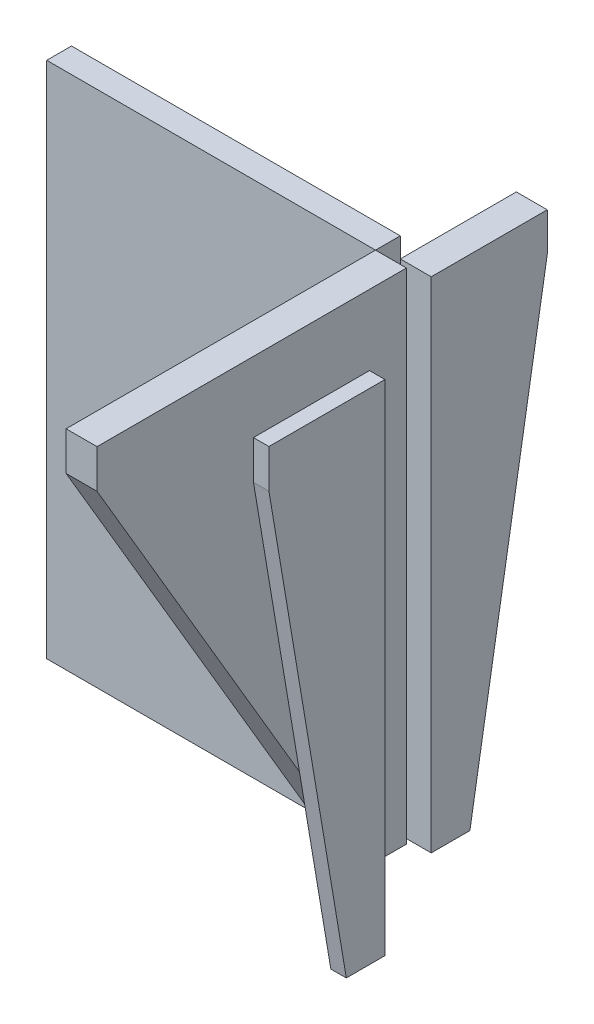
ISO-10303-21;
HEADER;
FILE_DESCRIPTION(('STEP AP214'),'2;1');
FILE_NAME('part.step','',(''),(''),'','','');
FILE_SCHEMA(('AUTOMOTIVE_DESIGN { 1 0 10303 214 1 1 1 1 }'));
ENDSEC;
DATA;
#1=APPLICATION_CONTEXT('core data for automotive mechanical design processes');
#2=APPLICATION_PROTOCOL_DEFINITION('international standard','automotive_design',2000,#1);
#3=PRODUCT_CONTEXT('',#1,'mechanical');
#4=PRODUCT('Part','Part','',(#3));
#5=PRODUCT_RELATED_PRODUCT_CATEGORY('part','',(#4));
#6=PRODUCT_DEFINITION_FORMATION('','',#4);
#7=PRODUCT_DEFINITION_CONTEXT('part definition',#1,'design');
#8=PRODUCT_DEFINITION('design','',#6,#7);
#9=PRODUCT_DEFINITION_SHAPE('','',#8);
#10=(LENGTH_UNIT() NAMED_UNIT(*) SI_UNIT(.MILLI.,.METRE.));
#11=(NAMED_UNIT(*) PLANE_ANGLE_UNIT() SI_UNIT($,.RADIAN.));
#12=(NAMED_UNIT(*) SI_UNIT($,.STERADIAN.) SOLID_ANGLE_UNIT());
#13=UNCERTAINTY_MEASURE_WITH_UNIT(LENGTH_MEASURE(1.E-05),#10,'distance_accuracy_value','');
#14=(GEOMETRIC_REPRESENTATION_CONTEXT(3) GLOBAL_UNCERTAINTY_ASSIGNED_CONTEXT((#13)) GLOBAL_UNIT_ASSIGNED_CONTEXT((#10,
#11,#12)) REPRESENTATION_CONTEXT('',''));
#15=CARTESIAN_POINT('',(0.,0.,0.));
#16=DIRECTION('',(0.,0.,1.));
#17=DIRECTION('',(1.,0.,0.));
#18=AXIS2_PLACEMENT_3D('',#15,#16,#17);
#19=CARTESIAN_POINT('',(465.,-670.851907967738,0.));
#20=DIRECTION('',(0.,0.,-1.));
#21=DIRECTION('',(-1.,0.,0.));
#22=AXIS2_PLACEMENT_3D('',#19,#20,#21);
#23=PLANE('',#22);
#24=DIRECTION('',(0.,-1.,0.));
#25=VECTOR('',#24,1.);
#26=CARTESIAN_POINT('',(425.,-670.851907967738,0.));
#27=LINE('',#26,#25);
#28=CARTESIAN_POINT('',(425.,-25.8519079677383,0.));
#29=VERTEX_POINT('',#28);
#30=CARTESIAN_POINT('',(425.,-670.851907967738,0.));
#31=VERTEX_POINT('',#30);
#32=EDGE_CURVE('E12',#29,#31,#27,.T.);
#33=ORIENTED_EDGE('',*,*,#32,.T.);
#34=DIRECTION('',(-1.,0.,0.));
#35=VECTOR('',#34,1.);
#36=CARTESIAN_POINT('',(465.,-670.851907967738,0.));
#37=LINE('',#36,#35);
#38=CARTESIAN_POINT('',(465.,-670.851907967738,0.));
#39=VERTEX_POINT('',#38);
#40=EDGE_CURVE('E139',#39,#31,#37,.T.);
#41=ORIENTED_EDGE('',*,*,#40,.F.);
#42=DIRECTION('',(0.,-1.,0.));
#43=VECTOR('',#42,1.);
#44=CARTESIAN_POINT('',(465.,-670.851907967738,0.));
#45=LINE('',#44,#43);
#46=CARTESIAN_POINT('',(465.,-25.8519079677382,0.));
#47=VERTEX_POINT('',#46);
#48=EDGE_CURVE('E56',#47,#39,#45,.T.);
#49=ORIENTED_EDGE('',*,*,#48,.F.);
#50=DIRECTION('',(-1.,0.,0.));
#51=VECTOR('',#50,1.);
#52=CARTESIAN_POINT('',(465.,-25.8519079677382,0.));
#53=LINE('',#52,#51);
#54=EDGE_CURVE('E132',#47,#29,#53,.T.);
#55=ORIENTED_EDGE('',*,*,#54,.T.);
#56=EDGE_LOOP('',(#33,#41,#49,#55));
#57=FACE_BOUND('',#56,.T.);
#58=ADVANCED_FACE('F52',(#57),#23,.F.);
#59=CARTESIAN_POINT('',(465.,-670.851907967738,-50.));
#60=DIRECTION('',(0.,1.,0.));
#61=DIRECTION('',(-1.,0.,0.));
#62=AXIS2_PLACEMENT_3D('',#59,#60,#61);
#63=PLANE('',#62);
#64=DIRECTION('',(0.,0.,-1.));
#65=VECTOR('',#64,1.);
#66=CARTESIAN_POINT('',(425.,-670.851907967738,-50.));
#67=LINE('',#66,#65);
#68=CARTESIAN_POINT('',(425.,-670.851907967738,-50.));
#69=VERTEX_POINT('',#68);
#70=EDGE_CURVE('E62',#31,#69,#67,.T.);
#71=ORIENTED_EDGE('',*,*,#70,.T.);
#72=DIRECTION('',(-1.,0.,0.));
#73=VECTOR('',#72,1.);
#74=CARTESIAN_POINT('',(465.,-670.851907967738,-50.));
#75=LINE('',#74,#73);
#76=CARTESIAN_POINT('',(465.,-670.851907967738,-50.));
#77=VERTEX_POINT('',#76);
#78=EDGE_CURVE('E114',#77,#69,#75,.T.);
#79=ORIENTED_EDGE('',*,*,#78,.F.);
#80=DIRECTION('',(0.,0.,-1.));
#81=VECTOR('',#80,1.);
#82=CARTESIAN_POINT('',(465.,-670.851907967738,-50.));
#83=LINE('',#82,#81);
#84=EDGE_CURVE('E89',#39,#77,#83,.T.);
#85=ORIENTED_EDGE('',*,*,#84,.F.);
#86=ORIENTED_EDGE('',*,*,#40,.T.);
#87=EDGE_LOOP('',(#71,#79,#85,#86));
#88=FACE_BOUND('',#87,.T.);
#89=ADVANCED_FACE('F152',(#88),#63,.F.);
#90=CARTESIAN_POINT('',(465.,-75.8519079677382,-150.));
#91=DIRECTION('',(0.,0.165742694417267,0.986169031782739));
#92=DIRECTION('',(0.,-0.986169031782739,0.165742694417267));
#93=AXIS2_PLACEMENT_3D('',#90,#91,#92);
#94=PLANE('',#93);
#95=DIRECTION('',(0.,0.986169031782739,-0.165742694417267));
#96=VECTOR('',#95,1.);
#97=CARTESIAN_POINT('',(425.,-75.8519079677383,-150.));
#98=LINE('',#97,#96);
#99=CARTESIAN_POINT('',(425.,-75.8519079677383,-150.));
#100=VERTEX_POINT('',#99);
#101=EDGE_CURVE('E108',#69,#100,#98,.T.);
#102=ORIENTED_EDGE('',*,*,#101,.T.);
#103=DIRECTION('',(-1.,0.,0.));
#104=VECTOR('',#103,1.);
#105=CARTESIAN_POINT('',(465.,-75.8519079677382,-150.));
#106=LINE('',#105,#104);
#107=CARTESIAN_POINT('',(465.,-75.8519079677382,-150.));
#108=VERTEX_POINT('',#107);
#109=EDGE_CURVE('E112',#108,#100,#106,.T.);
#110=ORIENTED_EDGE('',*,*,#109,.F.);
#111=DIRECTION('',(0.,0.986169031782739,-0.165742694417267));
#112=VECTOR('',#111,1.);
#113=CARTESIAN_POINT('',(465.,-75.8519079677382,-150.));
#114=LINE('',#113,#112);
#115=EDGE_CURVE('E134',#77,#108,#114,.T.);
#116=ORIENTED_EDGE('',*,*,#115,.F.);
#117=ORIENTED_EDGE('',*,*,#78,.T.);
#118=EDGE_LOOP('',(#102,#110,#116,#117));
#119=FACE_BOUND('',#118,.T.);
#120=ADVANCED_FACE('F110',(#119),#94,.F.);
#121=CARTESIAN_POINT('',(465.,-25.8519079677382,-150.));
#122=DIRECTION('',(0.,0.,1.));
#123=DIRECTION('',(1.,0.,0.));
#124=AXIS2_PLACEMENT_3D('',#121,#122,#123);
#125=PLANE('',#124);
#126=DIRECTION('',(0.,1.,0.));
#127=VECTOR('',#126,1.);
#128=CARTESIAN_POINT('',(425.,-25.8519079677383,-150.));
#129=LINE('',#128,#127);
#130=CARTESIAN_POINT('',(425.,-25.8519079677383,-150.));
#131=VERTEX_POINT('',#130);
#132=EDGE_CURVE('E116',#100,#131,#129,.T.);
#133=ORIENTED_EDGE('',*,*,#132,.T.);
#134=DIRECTION('',(-1.,0.,0.));
#135=VECTOR('',#134,1.);
#136=CARTESIAN_POINT('',(465.,-25.8519079677382,-150.));
#137=LINE('',#136,#135);
#138=CARTESIAN_POINT('',(465.,-25.8519079677382,-150.));
#139=VERTEX_POINT('',#138);
#140=EDGE_CURVE('E122',#139,#131,#137,.T.);
#141=ORIENTED_EDGE('',*,*,#140,.F.);
#142=DIRECTION('',(0.,1.,0.));
#143=VECTOR('',#142,1.);
#144=CARTESIAN_POINT('',(465.,-25.8519079677382,-150.));
#145=LINE('',#144,#143);
#146=EDGE_CURVE('E121',#108,#139,#145,.T.);
#147=ORIENTED_EDGE('',*,*,#146,.F.);
#148=ORIENTED_EDGE('',*,*,#109,.T.);
#149=EDGE_LOOP('',(#133,#141,#147,#148));
#150=FACE_BOUND('',#149,.T.);
#151=ADVANCED_FACE('F119',(#150),#125,.F.);
#152=CARTESIAN_POINT('',(465.,-25.8519079677382,0.));
#153=DIRECTION('',(0.,-1.,0.));
#154=DIRECTION('',(1.,0.,0.));
#155=AXIS2_PLACEMENT_3D('',#152,#153,#154);
#156=PLANE('',#155);
#157=DIRECTION('',(0.,0.,1.));
#158=VECTOR('',#157,1.);
#159=CARTESIAN_POINT('',(425.,-25.8519079677383,0.));
#160=LINE('',#159,#158);
#161=EDGE_CURVE('E100',#131,#29,#160,.T.);
#162=ORIENTED_EDGE('',*,*,#161,.T.);
#163=ORIENTED_EDGE('',*,*,#54,.F.);
#164=DIRECTION('',(0.,0.,1.));
#165=VECTOR('',#164,1.);
#166=CARTESIAN_POINT('',(465.,-25.8519079677382,0.));
#167=LINE('',#166,#165);
#168=EDGE_CURVE('E130',#139,#47,#167,.T.);
#169=ORIENTED_EDGE('',*,*,#168,.F.);
#170=ORIENTED_EDGE('',*,*,#140,.T.);
#171=EDGE_LOOP('',(#162,#163,#169,#170));
#172=FACE_BOUND('',#171,.T.);
#173=ADVANCED_FACE('F143',(#172),#156,.F.);
#174=CARTESIAN_POINT('',(465.,1.59564854933399E-13,0.));
#175=DIRECTION('',(-1.,0.,0.));
#176=DIRECTION('',(0.,-1.,0.));
#177=AXIS2_PLACEMENT_3D('',#174,#175,#176);
#178=PLANE('',#177);
#179=ORIENTED_EDGE('',*,*,#48,.T.);
#180=ORIENTED_EDGE('',*,*,#84,.T.);
#181=ORIENTED_EDGE('',*,*,#115,.T.);
#182=ORIENTED_EDGE('',*,*,#146,.T.);
#183=ORIENTED_EDGE('',*,*,#168,.T.);
#184=EDGE_LOOP('',(#179,#180,#181,#182,#183));
#185=FACE_BOUND('',#184,.T.);
#186=ADVANCED_FACE('F54',(#185),#178,.F.);
#187=CARTESIAN_POINT('',(425.,1.46308460609517E-13,0.));
#188=DIRECTION('',(-1.,0.,0.));
#189=DIRECTION('',(0.,-1.,0.));
#190=AXIS2_PLACEMENT_3D('',#187,#188,#189);
#191=PLANE('',#190);
#192=ORIENTED_EDGE('',*,*,#32,.F.);
#193=ORIENTED_EDGE('',*,*,#161,.F.);
#194=ORIENTED_EDGE('',*,*,#132,.F.);
#195=ORIENTED_EDGE('',*,*,#101,.F.);
#196=ORIENTED_EDGE('',*,*,#70,.F.);
#197=EDGE_LOOP('',(#192,#193,#194,#195,#196));
#198=FACE_BOUND('',#197,.T.);
#199=ADVANCED_FACE('F124',(#198),#191,.T.);
#200=CLOSED_SHELL('',(#58,#89,#120,#151,#173,#186,#199));
#201=MANIFOLD_SOLID_BREP('B2',#200);
#202=CARTESIAN_POINT('',(465.,1.59564854933399E-13,0.));
#203=DIRECTION('',(1.,0.,0.));
#204=DIRECTION('',(0.,1.,0.));
#205=AXIS2_PLACEMENT_3D('',#202,#203,#204);
#206=PLANE('',#205);
#207=DIRECTION('',(0.,0.,-1.));
#208=VECTOR('',#207,1.);
#209=CARTESIAN_POINT('',(465.,-90.9664170347094,229.771365320521));
#210=LINE('',#209,#208);
#211=CARTESIAN_POINT('',(465.,-90.9664170347094,229.771365320521));
#212=VERTEX_POINT('',#211);
#213=CARTESIAN_POINT('',(465.,-90.9664170347094,79.7713653205213));
#214=VERTEX_POINT('',#213);
#215=EDGE_CURVE('E326',#212,#214,#210,.T.);
#216=ORIENTED_EDGE('',*,*,#215,.T.);
#217=DIRECTION('',(0.,-1.,0.));
#218=VECTOR('',#217,1.);
#219=CARTESIAN_POINT('',(465.,-90.9664170347094,79.7713653205213));
#220=LINE('',#219,#218);
#221=CARTESIAN_POINT('',(465.,-645.,79.7713653205212));
#222=VERTEX_POINT('',#221);
#223=EDGE_CURVE('E356',#214,#222,#220,.T.);
#224=ORIENTED_EDGE('',*,*,#223,.T.);
#225=DIRECTION('',(0.,0.,-1.));
#226=VECTOR('',#225,1.);
#227=CARTESIAN_POINT('',(465.,-645.,82.));
#228=LINE('',#227,#226);
#229=CARTESIAN_POINT('',(465.,-645.,32.));
#230=VERTEX_POINT('',#229);
#231=EDGE_CURVE('E251',#222,#230,#228,.T.);
#232=ORIENTED_EDGE('',*,*,#231,.T.);
#233=DIRECTION('',(0.,1.,0.));
#234=VECTOR('',#233,1.);
#235=CARTESIAN_POINT('',(465.,-645.,32.));
#236=LINE('',#235,#234);
#237=CARTESIAN_POINT('',(465.,0.,32.));
#238=VERTEX_POINT('',#237);
#239=EDGE_CURVE('E368',#230,#238,#236,.T.);
#240=ORIENTED_EDGE('',*,*,#239,.T.);
#241=DIRECTION('',(0.,0.,1.));
#242=VECTOR('',#241,1.);
#243=CARTESIAN_POINT('',(465.,0.,32.));
#244=LINE('',#243,#242);
#245=CARTESIAN_POINT('',(465.,1.0511971204924E-13,432.));
#246=VERTEX_POINT('',#245);
#247=EDGE_CURVE('E284',#238,#246,#244,.T.);
#248=ORIENTED_EDGE('',*,*,#247,.T.);
#249=DIRECTION('',(0.,-1.,0.));
#250=VECTOR('',#249,1.);
#251=CARTESIAN_POINT('',(465.,1.0511971204924E-13,432.));
#252=LINE('',#251,#250);
#253=CARTESIAN_POINT('',(465.,-49.9999999999999,432.));
#254=VERTEX_POINT('',#253);
#255=EDGE_CURVE('E371',#246,#254,#252,.T.);
#256=ORIENTED_EDGE('',*,*,#255,.T.);
#257=DIRECTION('',(0.,-0.86193421515777,-0.507020126563394));
#258=VECTOR('',#257,1.);
#259=CARTESIAN_POINT('',(465.,-49.9999999999999,432.));
#260=LINE('',#259,#258);
#261=CARTESIAN_POINT('',(465.,-494.917583723274,170.283774280426));
#262=VERTEX_POINT('',#261);
#263=EDGE_CURVE('E374',#254,#262,#260,.T.);
#264=ORIENTED_EDGE('',*,*,#263,.T.);
#265=DIRECTION('',(0.,0.986169031782739,0.165742694417267));
#266=VECTOR('',#265,1.);
#267=CARTESIAN_POINT('',(465.,-735.96641703471,129.771365320521));
#268=LINE('',#267,#266);
#269=CARTESIAN_POINT('',(465.,-140.966417034709,229.771365320521));
#270=VERTEX_POINT('',#269);
#271=EDGE_CURVE('E50',#262,#270,#268,.T.);
#272=ORIENTED_EDGE('',*,*,#271,.T.);
#273=DIRECTION('',(0.,1.,0.));
#274=VECTOR('',#273,1.);
#275=CARTESIAN_POINT('',(465.,-140.966417034709,229.771365320521));
#276=LINE('',#275,#274);
#277=EDGE_CURVE('E242',#270,#212,#276,.T.);
#278=ORIENTED_EDGE('',*,*,#277,.T.);
#279=EDGE_LOOP('',(#216,#224,#232,#240,#248,#256,#264,#272,#278));
#280=FACE_BOUND('',#279,.T.);
#281=ADVANCED_FACE('F225',(#280),#206,.T.);
#282=CARTESIAN_POINT('',(465.,-645.,32.));
#283=DIRECTION('',(0.,0.,1.));
#284=DIRECTION('',(1.,0.,0.));
#285=AXIS2_PLACEMENT_3D('',#282,#283,#284);
#286=PLANE('',#285);
#287=DIRECTION('',(0.,1.,0.));
#288=VECTOR('',#287,1.);
#289=CARTESIAN_POINT('',(425.,-645.,32.));
#290=LINE('',#289,#288);
#291=CARTESIAN_POINT('',(425.,-645.,32.));
#292=VERTEX_POINT('',#291);
#293=CARTESIAN_POINT('',(425.,0.,32.));
#294=VERTEX_POINT('',#293);
#295=EDGE_CURVE('E361',#292,#294,#290,.T.);
#296=ORIENTED_EDGE('',*,*,#295,.T.);
#297=DIRECTION('',(-1.,0.,0.));
#298=VECTOR('',#297,1.);
#299=CARTESIAN_POINT('',(465.,0.,32.));
#300=LINE('',#299,#298);
#301=EDGE_CURVE('E229',#238,#294,#300,.T.);
#302=ORIENTED_EDGE('',*,*,#301,.F.);
#303=ORIENTED_EDGE('',*,*,#239,.F.);
#304=DIRECTION('',(-1.,0.,0.));
#305=VECTOR('',#304,1.);
#306=CARTESIAN_POINT('',(465.,-645.,32.));
#307=LINE('',#306,#305);
#308=EDGE_CURVE('E379',#230,#292,#307,.T.);
#309=ORIENTED_EDGE('',*,*,#308,.T.);
#310=EDGE_LOOP('',(#296,#302,#303,#309));
#311=FACE_BOUND('',#310,.T.);
#312=ADVANCED_FACE('F227',(#311),#286,.F.);
#313=CARTESIAN_POINT('',(465.,0.,32.));
#314=DIRECTION('',(0.,-1.,0.));
#315=DIRECTION('',(1.,0.,0.));
#316=AXIS2_PLACEMENT_3D('',#313,#314,#315);
#317=PLANE('',#316);
#318=DIRECTION('',(0.,0.,1.));
#319=VECTOR('',#318,1.);
#320=CARTESIAN_POINT('',(425.,0.,32.));
#321=LINE('',#320,#319);
#322=CARTESIAN_POINT('',(425.,0.,432.));
#323=VERTEX_POINT('',#322);
#324=EDGE_CURVE('E382',#294,#323,#321,.T.);
#325=ORIENTED_EDGE('',*,*,#324,.T.);
#326=DIRECTION('',(-1.,0.,0.));
#327=VECTOR('',#326,1.);
#328=CARTESIAN_POINT('',(465.,1.0511971204924E-13,432.));
#329=LINE('',#328,#327);
#330=EDGE_CURVE('E394',#246,#323,#329,.T.);
#331=ORIENTED_EDGE('',*,*,#330,.F.);
#332=ORIENTED_EDGE('',*,*,#247,.F.);
#333=ORIENTED_EDGE('',*,*,#301,.T.);
#334=EDGE_LOOP('',(#325,#331,#332,#333));
#335=FACE_BOUND('',#334,.T.);
#336=ADVANCED_FACE('F400',(#335),#317,.F.);
#337=CARTESIAN_POINT('',(465.,1.0511971204924E-13,432.));
#338=DIRECTION('',(0.,0.,-1.));
#339=DIRECTION('',(-1.,0.,0.));
#340=AXIS2_PLACEMENT_3D('',#337,#338,#339);
#341=PLANE('',#340);
#342=DIRECTION('',(0.,-1.,0.));
#343=VECTOR('',#342,1.);
#344=CARTESIAN_POINT('',(425.,0.,432.));
#345=LINE('',#344,#343);
#346=CARTESIAN_POINT('',(425.,-49.9999999999999,432.));
#347=VERTEX_POINT('',#346);
#348=EDGE_CURVE('E384',#323,#347,#345,.T.);
#349=ORIENTED_EDGE('',*,*,#348,.T.);
#350=DIRECTION('',(-1.,0.,0.));
#351=VECTOR('',#350,1.);
#352=CARTESIAN_POINT('',(465.,-49.9999999999999,432.));
#353=LINE('',#352,#351);
#354=EDGE_CURVE('E392',#254,#347,#353,.T.);
#355=ORIENTED_EDGE('',*,*,#354,.F.);
#356=ORIENTED_EDGE('',*,*,#255,.F.);
#357=ORIENTED_EDGE('',*,*,#330,.T.);
#358=EDGE_LOOP('',(#349,#355,#356,#357));
#359=FACE_BOUND('',#358,.T.);
#360=ADVANCED_FACE('F408',(#359),#341,.F.);
#361=CARTESIAN_POINT('',(465.,-49.9999999999999,432.));
#362=DIRECTION('',(0.,0.507020126563394,-0.861934215157769));
#363=DIRECTION('',(0.,0.861934215157769,0.507020126563394));
#364=AXIS2_PLACEMENT_3D('',#361,#362,#363);
#365=PLANE('',#364);
#366=DIRECTION('',(0.,-0.86193421515777,-0.507020126563394));
#367=VECTOR('',#366,1.);
#368=CARTESIAN_POINT('',(425.,-49.9999999999999,432.));
#369=LINE('',#368,#367);
#370=CARTESIAN_POINT('',(425.,-645.,82.));
#371=VERTEX_POINT('',#370);
#372=EDGE_CURVE('E386',#347,#371,#369,.T.);
#373=ORIENTED_EDGE('',*,*,#372,.T.);
#374=DIRECTION('',(-1.,0.,0.));
#375=VECTOR('',#374,1.);
#376=CARTESIAN_POINT('',(465.,-645.,82.));
#377=LINE('',#376,#375);
#378=CARTESIAN_POINT('',(465.,-645.,82.));
#379=VERTEX_POINT('',#378);
#380=EDGE_CURVE('E390',#379,#371,#377,.T.);
#381=ORIENTED_EDGE('',*,*,#380,.F.);
#382=EDGE_CURVE('E373',#262,#379,#260,.T.);
#383=ORIENTED_EDGE('',*,*,#382,.F.);
#384=ORIENTED_EDGE('',*,*,#263,.F.);
#385=ORIENTED_EDGE('',*,*,#354,.T.);
#386=EDGE_LOOP('',(#373,#381,#383,#384,#385));
#387=FACE_BOUND('',#386,.T.);
#388=ADVANCED_FACE('F411',(#387),#365,.F.);
#389=CARTESIAN_POINT('',(465.,-645.,82.));
#390=DIRECTION('',(0.,1.,0.));
#391=DIRECTION('',(-1.,0.,0.));
#392=AXIS2_PLACEMENT_3D('',#389,#390,#391);
#393=PLANE('',#392);
#394=DIRECTION('',(0.,0.,-1.));
#395=VECTOR('',#394,1.);
#396=CARTESIAN_POINT('',(425.,-645.,82.));
#397=LINE('',#396,#395);
#398=EDGE_CURVE('E276',#371,#292,#397,.T.);
#399=ORIENTED_EDGE('',*,*,#398,.T.);
#400=ORIENTED_EDGE('',*,*,#308,.F.);
#401=ORIENTED_EDGE('',*,*,#231,.F.);
#402=EDGE_CURVE('E377',#379,#222,#228,.T.);
#403=ORIENTED_EDGE('',*,*,#402,.F.);
#404=ORIENTED_EDGE('',*,*,#380,.T.);
#405=EDGE_LOOP('',(#399,#400,#401,#403,#404));
#406=FACE_BOUND('',#405,.T.);
#407=ADVANCED_FACE('F427',(#406),#393,.F.);
#408=CARTESIAN_POINT('',(425.,1.46308460609517E-13,0.));
#409=DIRECTION('',(1.,0.,0.));
#410=DIRECTION('',(0.,1.,0.));
#411=AXIS2_PLACEMENT_3D('',#408,#409,#410);
#412=PLANE('',#411);
#413=ORIENTED_EDGE('',*,*,#295,.F.);
#414=ORIENTED_EDGE('',*,*,#398,.F.);
#415=ORIENTED_EDGE('',*,*,#372,.F.);
#416=ORIENTED_EDGE('',*,*,#348,.F.);
#417=ORIENTED_EDGE('',*,*,#324,.F.);
#418=EDGE_LOOP('',(#413,#414,#415,#416,#417));
#419=FACE_BOUND('',#418,.T.);
#420=ADVANCED_FACE('F405',(#419),#412,.F.);
#421=CARTESIAN_POINT('',(485.,-140.966417034709,229.771365320521));
#422=DIRECTION('',(0.,0.,1.));
#423=DIRECTION('',(1.,0.,0.));
#424=AXIS2_PLACEMENT_3D('',#421,#422,#423);
#425=PLANE('',#424);
#426=ORIENTED_EDGE('',*,*,#277,.F.);
#427=DIRECTION('',(-1.,0.,0.));
#428=VECTOR('',#427,1.);
#429=CARTESIAN_POINT('',(485.,-140.966417034709,229.771365320521));
#430=LINE('',#429,#428);
#431=CARTESIAN_POINT('',(485.,-140.966417034709,229.771365320521));
#432=VERTEX_POINT('',#431);
#433=EDGE_CURVE('E343',#432,#270,#430,.T.);
#434=ORIENTED_EDGE('',*,*,#433,.F.);
#435=DIRECTION('',(0.,1.,0.));
#436=VECTOR('',#435,1.);
#437=CARTESIAN_POINT('',(485.,-140.966417034709,229.771365320521));
#438=LINE('',#437,#436);
#439=CARTESIAN_POINT('',(485.,-90.9664170347094,229.771365320521));
#440=VERTEX_POINT('',#439);
#441=EDGE_CURVE('E336',#432,#440,#438,.T.);
#442=ORIENTED_EDGE('',*,*,#441,.T.);
#443=DIRECTION('',(-1.,0.,0.));
#444=VECTOR('',#443,1.);
#445=CARTESIAN_POINT('',(485.,-90.9664170347094,229.771365320521));
#446=LINE('',#445,#444);
#447=EDGE_CURVE('E321',#440,#212,#446,.T.);
#448=ORIENTED_EDGE('',*,*,#447,.T.);
#449=EDGE_LOOP('',(#426,#434,#442,#448));
#450=FACE_BOUND('',#449,.T.);
#451=ADVANCED_FACE('F342',(#450),#425,.T.);
#452=CARTESIAN_POINT('',(485.,-735.96641703471,129.771365320521));
#453=DIRECTION('',(0.,-0.165742694417267,0.986169031782739));
#454=DIRECTION('',(0.,-0.986169031782739,-0.165742694417267));
#455=AXIS2_PLACEMENT_3D('',#452,#453,#454);
#456=PLANE('',#455);
#457=CARTESIAN_POINT('',(465.,-735.96641703471,129.771365320521));
#458=VERTEX_POINT('',#457);
#459=EDGE_CURVE('E235',#458,#262,#268,.T.);
#460=ORIENTED_EDGE('',*,*,#459,.F.);
#461=DIRECTION('',(-1.,0.,0.));
#462=VECTOR('',#461,1.);
#463=CARTESIAN_POINT('',(485.,-735.96641703471,129.771365320521));
#464=LINE('',#463,#462);
#465=CARTESIAN_POINT('',(485.,-735.96641703471,129.771365320521));
#466=VERTEX_POINT('',#465);
#467=EDGE_CURVE('E362',#466,#458,#464,.T.);
#468=ORIENTED_EDGE('',*,*,#467,.F.);
#469=DIRECTION('',(0.,0.986169031782739,0.165742694417267));
#470=VECTOR('',#469,1.);
#471=CARTESIAN_POINT('',(485.,-735.96641703471,129.771365320521));
#472=LINE('',#471,#470);
#473=EDGE_CURVE('E329',#466,#432,#472,.T.);
#474=ORIENTED_EDGE('',*,*,#473,.T.);
#475=ORIENTED_EDGE('',*,*,#433,.T.);
#476=ORIENTED_EDGE('',*,*,#271,.F.);
#477=EDGE_LOOP('',(#460,#468,#474,#475,#476));
#478=FACE_BOUND('',#477,.T.);
#479=ADVANCED_FACE('F416',(#478),#456,.T.);
#480=CARTESIAN_POINT('',(485.,-735.96641703471,79.7713653205212));
#481=DIRECTION('',(0.,-1.,0.));
#482=DIRECTION('',(1.,0.,0.));
#483=AXIS2_PLACEMENT_3D('',#480,#481,#482);
#484=PLANE('',#483);
#485=DIRECTION('',(0.,0.,1.));
#486=VECTOR('',#485,1.);
#487=CARTESIAN_POINT('',(465.,-735.96641703471,79.7713653205212));
#488=LINE('',#487,#486);
#489=CARTESIAN_POINT('',(465.,-735.96641703471,79.7713653205212));
#490=VERTEX_POINT('',#489);
#491=EDGE_CURVE('E346',#490,#458,#488,.T.);
#492=ORIENTED_EDGE('',*,*,#491,.F.);
#493=DIRECTION('',(-1.,0.,0.));
#494=VECTOR('',#493,1.);
#495=CARTESIAN_POINT('',(485.,-735.96641703471,79.7713653205212));
#496=LINE('',#495,#494);
#497=CARTESIAN_POINT('',(485.,-735.96641703471,79.7713653205212));
#498=VERTEX_POINT('',#497);
#499=EDGE_CURVE('E364',#498,#490,#496,.T.);
#500=ORIENTED_EDGE('',*,*,#499,.F.);
#501=DIRECTION('',(0.,0.,1.));
#502=VECTOR('',#501,1.);
#503=CARTESIAN_POINT('',(485.,-735.96641703471,79.7713653205212));
#504=LINE('',#503,#502);
#505=EDGE_CURVE('E349',#498,#466,#504,.T.);
#506=ORIENTED_EDGE('',*,*,#505,.T.);
#507=ORIENTED_EDGE('',*,*,#467,.T.);
#508=EDGE_LOOP('',(#492,#500,#506,#507));
#509=FACE_BOUND('',#508,.T.);
#510=ADVANCED_FACE('F422',(#509),#484,.T.);
#511=CARTESIAN_POINT('',(485.,-90.9664170347094,79.7713653205213));
#512=DIRECTION('',(0.,0.,-1.));
#513=DIRECTION('',(0.,1.,0.));
#514=AXIS2_PLACEMENT_3D('',#511,#512,#513);
#515=PLANE('',#514);
#516=ORIENTED_EDGE('',*,*,#223,.F.);
#517=DIRECTION('',(-1.,0.,0.));
#518=VECTOR('',#517,1.);
#519=CARTESIAN_POINT('',(485.,-90.9664170347094,79.7713653205213));
#520=LINE('',#519,#518);
#521=CARTESIAN_POINT('',(485.,-90.9664170347094,79.7713653205213));
#522=VERTEX_POINT('',#521);
#523=EDGE_CURVE('E328',#522,#214,#520,.T.);
#524=ORIENTED_EDGE('',*,*,#523,.F.);
#525=DIRECTION('',(0.,-1.,0.));
#526=VECTOR('',#525,1.);
#527=CARTESIAN_POINT('',(485.,-90.9664170347094,79.7713653205213));
#528=LINE('',#527,#526);
#529=EDGE_CURVE('E340',#522,#498,#528,.T.);
#530=ORIENTED_EDGE('',*,*,#529,.T.);
#531=ORIENTED_EDGE('',*,*,#499,.T.);
#532=EDGE_CURVE('E355',#222,#490,#220,.T.);
#533=ORIENTED_EDGE('',*,*,#532,.F.);
#534=EDGE_LOOP('',(#516,#524,#530,#531,#533));
#535=FACE_BOUND('',#534,.T.);
#536=ADVANCED_FACE('F425',(#535),#515,.T.);
#537=CARTESIAN_POINT('',(485.,-90.9664170347094,229.771365320521));
#538=DIRECTION('',(0.,1.,0.));
#539=DIRECTION('',(-1.,0.,0.));
#540=AXIS2_PLACEMENT_3D('',#537,#538,#539);
#541=PLANE('',#540);
#542=ORIENTED_EDGE('',*,*,#215,.F.);
#543=ORIENTED_EDGE('',*,*,#447,.F.);
#544=DIRECTION('',(0.,0.,-1.));
#545=VECTOR('',#544,1.);
#546=CARTESIAN_POINT('',(485.,-90.9664170347094,229.771365320521));
#547=LINE('',#546,#545);
#548=EDGE_CURVE('E324',#440,#522,#547,.T.);
#549=ORIENTED_EDGE('',*,*,#548,.T.);
#550=ORIENTED_EDGE('',*,*,#523,.T.);
#551=EDGE_LOOP('',(#542,#543,#549,#550));
#552=FACE_BOUND('',#551,.T.);
#553=ADVANCED_FACE('F323',(#552),#541,.T.);
#554=CARTESIAN_POINT('',(485.,0.,0.));
#555=DIRECTION('',(-1.,0.,0.));
#556=DIRECTION('',(0.,0.,1.));
#557=AXIS2_PLACEMENT_3D('',#554,#555,#556);
#558=PLANE('',#557);
#559=ORIENTED_EDGE('',*,*,#441,.F.);
#560=ORIENTED_EDGE('',*,*,#473,.F.);
#561=ORIENTED_EDGE('',*,*,#505,.F.);
#562=ORIENTED_EDGE('',*,*,#529,.F.);
#563=ORIENTED_EDGE('',*,*,#548,.F.);
#564=EDGE_LOOP('',(#559,#560,#561,#562,#563));
#565=FACE_BOUND('',#564,.T.);
#566=ADVANCED_FACE('F334',(#565),#558,.F.);
#567=CARTESIAN_POINT('',(465.,0.,0.));
#568=DIRECTION('',(-1.,0.,0.));
#569=DIRECTION('',(0.,0.,1.));
#570=AXIS2_PLACEMENT_3D('',#567,#568,#569);
#571=PLANE('',#570);
#572=ORIENTED_EDGE('',*,*,#459,.T.);
#573=ORIENTED_EDGE('',*,*,#382,.T.);
#574=ORIENTED_EDGE('',*,*,#402,.T.);
#575=ORIENTED_EDGE('',*,*,#532,.T.);
#576=ORIENTED_EDGE('',*,*,#491,.T.);
#577=EDGE_LOOP('',(#572,#573,#574,#575,#576));
#578=FACE_BOUND('',#577,.T.);
#579=ADVANCED_FACE('F418',(#578),#571,.T.);
#580=CLOSED_SHELL('',(#281,#312,#336,#360,#388,#407,#420,#451,#479,#510,#536,#553,#566,#579));
#581=MANIFOLD_SOLID_BREP('B6',#580);
#582=CARTESIAN_POINT('',(0.,0.,32.));
#583=DIRECTION('',(1.,0.,0.));
#584=DIRECTION('',(0.,1.,0.));
#585=AXIS2_PLACEMENT_3D('',#582,#583,#584);
#586=PLANE('',#585);
#587=DIRECTION('',(0.,-1.,0.));
#588=VECTOR('',#587,1.);
#589=CARTESIAN_POINT('',(0.,0.,0.));
#590=LINE('',#589,#588);
#591=CARTESIAN_POINT('',(0.,0.,0.));
#592=VERTEX_POINT('',#591);
#593=CARTESIAN_POINT('',(2.22044604925031E-13,-670.,0.));
#594=VERTEX_POINT('',#593);
#595=EDGE_CURVE('E632',#592,#594,#590,.T.);
#596=ORIENTED_EDGE('',*,*,#595,.T.);
#597=DIRECTION('',(0.,0.,-1.));
#598=VECTOR('',#597,1.);
#599=CARTESIAN_POINT('',(2.22044604925031E-13,-670.,32.));
#600=LINE('',#599,#598);
#601=CARTESIAN_POINT('',(2.22044604925031E-13,-670.,32.));
#602=VERTEX_POINT('',#601);
#603=EDGE_CURVE('E223',#602,#594,#600,.T.);
#604=ORIENTED_EDGE('',*,*,#603,.F.);
#605=DIRECTION('',(0.,-1.,0.));
#606=VECTOR('',#605,1.);
#607=CARTESIAN_POINT('',(0.,0.,32.));
#608=LINE('',#607,#606);
#609=CARTESIAN_POINT('',(0.,0.,32.));
#610=VERTEX_POINT('',#609);
#611=EDGE_CURVE('E620',#610,#602,#608,.T.);
#612=ORIENTED_EDGE('',*,*,#611,.F.);
#613=DIRECTION('',(0.,0.,-1.));
#614=VECTOR('',#613,1.);
#615=CARTESIAN_POINT('',(0.,0.,32.));
#616=LINE('',#615,#614);
#617=EDGE_CURVE('E628',#610,#592,#616,.T.);
#618=ORIENTED_EDGE('',*,*,#617,.T.);
#619=EDGE_LOOP('',(#596,#604,#612,#618));
#620=FACE_BOUND('',#619,.T.);
#621=ADVANCED_FACE('F569',(#620),#586,.F.);
#622=CARTESIAN_POINT('',(2.22044604925031E-13,-670.,32.));
#623=DIRECTION('',(0.,1.,0.));
#624=DIRECTION('',(0.,0.,1.));
#625=AXIS2_PLACEMENT_3D('',#622,#623,#624);
#626=PLANE('',#625);
#627=DIRECTION('',(1.,0.,0.));
#628=VECTOR('',#627,1.);
#629=CARTESIAN_POINT('',(2.22044604925031E-13,-670.,0.));
#630=LINE('',#629,#628);
#631=CARTESIAN_POINT('',(425.,-670.,0.));
#632=VERTEX_POINT('',#631);
#633=EDGE_CURVE('E624',#594,#632,#630,.T.);
#634=ORIENTED_EDGE('',*,*,#633,.T.);
#635=DIRECTION('',(0.,0.,-1.));
#636=VECTOR('',#635,1.);
#637=CARTESIAN_POINT('',(425.,-670.,32.));
#638=LINE('',#637,#636);
#639=CARTESIAN_POINT('',(425.,-670.,32.));
#640=VERTEX_POINT('',#639);
#641=EDGE_CURVE('E577',#640,#632,#638,.T.);
#642=ORIENTED_EDGE('',*,*,#641,.F.);
#643=DIRECTION('',(1.,0.,0.));
#644=VECTOR('',#643,1.);
#645=CARTESIAN_POINT('',(2.22044604925031E-13,-670.,32.));
#646=LINE('',#645,#644);
#647=EDGE_CURVE('E615',#602,#640,#646,.T.);
#648=ORIENTED_EDGE('',*,*,#647,.F.);
#649=ORIENTED_EDGE('',*,*,#603,.T.);
#650=EDGE_LOOP('',(#634,#642,#648,#649));
#651=FACE_BOUND('',#650,.T.);
#652=ADVANCED_FACE('F623',(#651),#626,.F.);
#653=CARTESIAN_POINT('',(425.,0.,32.));
#654=DIRECTION('',(-1.,0.,0.));
#655=DIRECTION('',(0.,-1.,0.));
#656=AXIS2_PLACEMENT_3D('',#653,#654,#655);
#657=PLANE('',#656);
#658=DIRECTION('',(0.,1.,0.));
#659=VECTOR('',#658,1.);
#660=CARTESIAN_POINT('',(425.,0.,0.));
#661=LINE('',#660,#659);
#662=CARTESIAN_POINT('',(425.,0.,0.));
#663=VERTEX_POINT('',#662);
#664=EDGE_CURVE('E602',#632,#663,#661,.T.);
#665=ORIENTED_EDGE('',*,*,#664,.T.);
#666=DIRECTION('',(0.,0.,-1.));
#667=VECTOR('',#666,1.);
#668=CARTESIAN_POINT('',(425.,0.,32.));
#669=LINE('',#668,#667);
#670=CARTESIAN_POINT('',(425.,0.,32.));
#671=VERTEX_POINT('',#670);
#672=EDGE_CURVE('E625',#671,#663,#669,.T.);
#673=ORIENTED_EDGE('',*,*,#672,.F.);
#674=DIRECTION('',(0.,1.,0.));
#675=VECTOR('',#674,1.);
#676=CARTESIAN_POINT('',(425.,0.,32.));
#677=LINE('',#676,#675);
#678=EDGE_CURVE('E618',#640,#671,#677,.T.);
#679=ORIENTED_EDGE('',*,*,#678,.F.);
#680=ORIENTED_EDGE('',*,*,#641,.T.);
#681=EDGE_LOOP('',(#665,#673,#679,#680));
#682=FACE_BOUND('',#681,.T.);
#683=ADVANCED_FACE('F626',(#682),#657,.F.);
#684=CARTESIAN_POINT('',(0.,0.,32.));
#685=DIRECTION('',(0.,-1.,0.));
#686=DIRECTION('',(0.,0.,-1.));
#687=AXIS2_PLACEMENT_3D('',#684,#685,#686);
#688=PLANE('',#687);
#689=DIRECTION('',(-1.,0.,0.));
#690=VECTOR('',#689,1.);
#691=CARTESIAN_POINT('',(0.,0.,0.));
#692=LINE('',#691,#690);
#693=EDGE_CURVE('E608',#663,#592,#692,.T.);
#694=ORIENTED_EDGE('',*,*,#693,.T.);
#695=ORIENTED_EDGE('',*,*,#617,.F.);
#696=DIRECTION('',(-1.,0.,0.));
#697=VECTOR('',#696,1.);
#698=CARTESIAN_POINT('',(0.,0.,32.));
#699=LINE('',#698,#697);
#700=EDGE_CURVE('E585',#671,#610,#699,.T.);
#701=ORIENTED_EDGE('',*,*,#700,.F.);
#702=ORIENTED_EDGE('',*,*,#672,.T.);
#703=EDGE_LOOP('',(#694,#695,#701,#702));
#704=FACE_BOUND('',#703,.T.);
#705=ADVANCED_FACE('F639',(#704),#688,.F.);
#706=CARTESIAN_POINT('',(0.,0.,32.));
#707=DIRECTION('',(0.,0.,1.));
#708=DIRECTION('',(1.,0.,0.));
#709=AXIS2_PLACEMENT_3D('',#706,#707,#708);
#710=PLANE('',#709);
#711=ORIENTED_EDGE('',*,*,#611,.T.);
#712=ORIENTED_EDGE('',*,*,#647,.T.);
#713=ORIENTED_EDGE('',*,*,#678,.T.);
#714=ORIENTED_EDGE('',*,*,#700,.T.);
#715=EDGE_LOOP('',(#711,#712,#713,#714));
#716=FACE_BOUND('',#715,.T.);
#717=ADVANCED_FACE('F616',(#716),#710,.T.);
#718=CARTESIAN_POINT('',(0.,0.,0.));
#719=DIRECTION('',(0.,0.,1.));
#720=DIRECTION('',(1.,0.,0.));
#721=AXIS2_PLACEMENT_3D('',#718,#719,#720);
#722=PLANE('',#721);
#723=ORIENTED_EDGE('',*,*,#595,.F.);
#724=ORIENTED_EDGE('',*,*,#693,.F.);
#725=ORIENTED_EDGE('',*,*,#664,.F.);
#726=ORIENTED_EDGE('',*,*,#633,.F.);
#727=EDGE_LOOP('',(#723,#724,#725,#726));
#728=FACE_BOUND('',#727,.T.);
#729=ADVANCED_FACE('F642',(#728),#722,.F.);
#730=CLOSED_SHELL('',(#621,#652,#683,#705,#717,#729));
#731=MANIFOLD_SOLID_BREP('B44',#730);
#732=ADVANCED_BREP_SHAPE_REPRESENTATION('',(#18,#201,#581,#731),#14);
#733=SHAPE_DEFINITION_REPRESENTATION(#9,#732);
ENDSEC;
END-ISO-10303-21;
